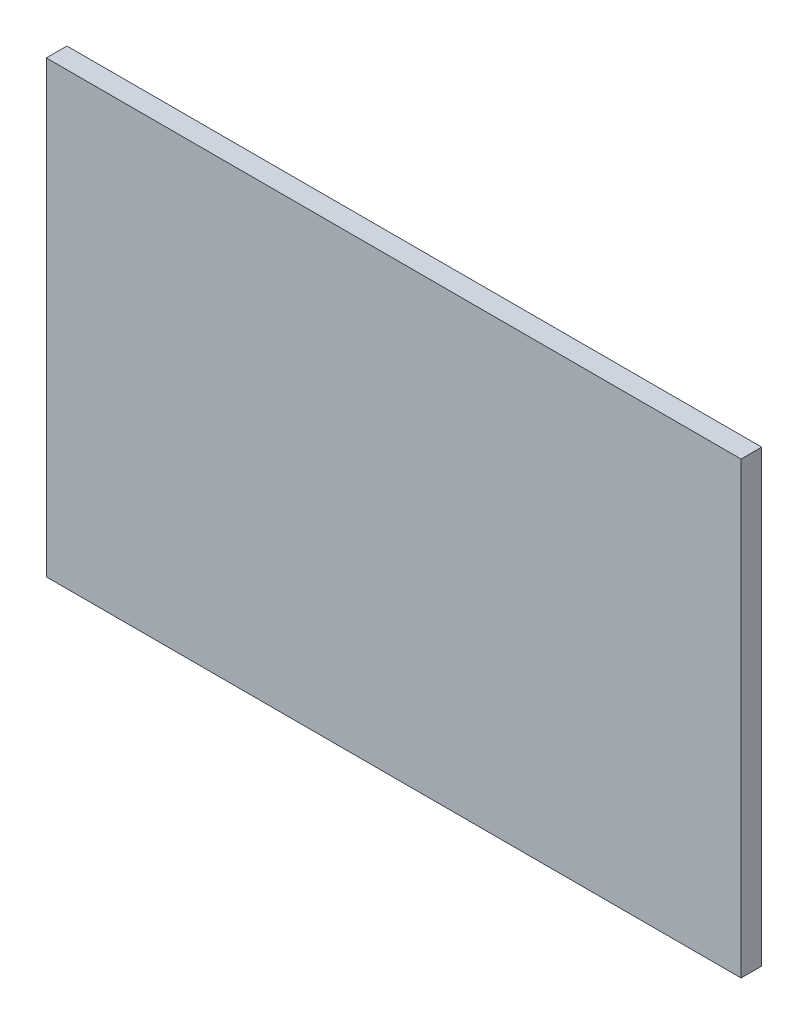
ISO-10303-21;
HEADER;
FILE_DESCRIPTION(('STEP AP214'),'2;1');
FILE_NAME('part.step','',(''),(''),'','','');
FILE_SCHEMA(('AUTOMOTIVE_DESIGN { 1 0 10303 214 1 1 1 1 }'));
ENDSEC;
DATA;
#1=APPLICATION_CONTEXT('core data for automotive mechanical design processes');
#2=APPLICATION_PROTOCOL_DEFINITION('international standard','automotive_design',2000,#1);
#3=PRODUCT_CONTEXT('',#1,'mechanical');
#4=PRODUCT('Part','Part','',(#3));
#5=PRODUCT_RELATED_PRODUCT_CATEGORY('part','',(#4));
#6=PRODUCT_DEFINITION_FORMATION('','',#4);
#7=PRODUCT_DEFINITION_CONTEXT('part definition',#1,'design');
#8=PRODUCT_DEFINITION('design','',#6,#7);
#9=PRODUCT_DEFINITION_SHAPE('','',#8);
#10=(LENGTH_UNIT() NAMED_UNIT(*) SI_UNIT(.MILLI.,.METRE.));
#11=(NAMED_UNIT(*) PLANE_ANGLE_UNIT() SI_UNIT($,.RADIAN.));
#12=(NAMED_UNIT(*) SI_UNIT($,.STERADIAN.) SOLID_ANGLE_UNIT());
#13=UNCERTAINTY_MEASURE_WITH_UNIT(LENGTH_MEASURE(1.E-05),#10,'distance_accuracy_value','');
#14=(GEOMETRIC_REPRESENTATION_CONTEXT(3) GLOBAL_UNCERTAINTY_ASSIGNED_CONTEXT((#13)) GLOBAL_UNIT_ASSIGNED_CONTEXT((#10,
#11,#12)) REPRESENTATION_CONTEXT('',''));
#15=CARTESIAN_POINT('',(0.,0.,0.));
#16=DIRECTION('',(0.,0.,1.));
#17=DIRECTION('',(1.,0.,0.));
#18=AXIS2_PLACEMENT_3D('',#15,#16,#17);
#19=CARTESIAN_POINT('',(84.25,-38.7195,5.));
#20=DIRECTION('',(0.,-1.,0.));
#21=DIRECTION('',(0.,0.,-1.));
#22=AXIS2_PLACEMENT_3D('',#19,#20,#21);
#23=PLANE('',#22);
#24=DIRECTION('',(-1.,0.,0.));
#25=VECTOR('',#24,1.);
#26=CARTESIAN_POINT('',(84.25,-38.7195,0.));
#27=LINE('',#26,#25);
#28=CARTESIAN_POINT('',(84.25,-38.7195,0.));
#29=VERTEX_POINT('',#28);
#30=CARTESIAN_POINT('',(-84.25,-38.7195,0.));
#31=VERTEX_POINT('',#30);
#32=EDGE_CURVE('E116',#29,#31,#27,.T.);
#33=ORIENTED_EDGE('',*,*,#32,.F.);
#34=DIRECTION('',(0.,0.,-1.));
#35=VECTOR('',#34,1.);
#36=CARTESIAN_POINT('',(84.25,-38.7195,5.));
#37=LINE('',#36,#35);
#38=CARTESIAN_POINT('',(84.25,-38.7195,5.));
#39=VERTEX_POINT('',#38);
#40=EDGE_CURVE('E11',#39,#29,#37,.T.);
#41=ORIENTED_EDGE('',*,*,#40,.F.);
#42=DIRECTION('',(-1.,0.,0.));
#43=VECTOR('',#42,1.);
#44=CARTESIAN_POINT('',(84.25,-38.7195,5.));
#45=LINE('',#44,#43);
#46=CARTESIAN_POINT('',(-84.25,-38.7195,5.));
#47=VERTEX_POINT('',#46);
#48=EDGE_CURVE('E109',#39,#47,#45,.T.);
#49=ORIENTED_EDGE('',*,*,#48,.T.);
#50=DIRECTION('',(0.,0.,-1.));
#51=VECTOR('',#50,1.);
#52=CARTESIAN_POINT('',(-84.25,-38.7195,5.));
#53=LINE('',#52,#51);
#54=EDGE_CURVE('E48',#47,#31,#53,.T.);
#55=ORIENTED_EDGE('',*,*,#54,.T.);
#56=EDGE_LOOP('',(#33,#41,#49,#55));
#57=FACE_BOUND('',#56,.T.);
#58=ADVANCED_FACE('F45',(#57),#23,.T.);
#59=CARTESIAN_POINT('',(84.25,-38.7195,5.));
#60=DIRECTION('',(-1.,0.,0.));
#61=DIRECTION('',(0.,-1.,0.));
#62=AXIS2_PLACEMENT_3D('',#59,#60,#61);
#63=PLANE('',#62);
#64=DIRECTION('',(0.,1.,0.));
#65=VECTOR('',#64,1.);
#66=CARTESIAN_POINT('',(84.25,-38.7195,0.));
#67=LINE('',#66,#65);
#68=CARTESIAN_POINT('',(84.25,70.2805,0.));
#69=VERTEX_POINT('',#68);
#70=EDGE_CURVE('E79',#29,#69,#67,.T.);
#71=ORIENTED_EDGE('',*,*,#70,.T.);
#72=DIRECTION('',(0.,0.,-1.));
#73=VECTOR('',#72,1.);
#74=CARTESIAN_POINT('',(84.25,70.2805,5.));
#75=LINE('',#74,#73);
#76=CARTESIAN_POINT('',(84.25,70.2805,5.));
#77=VERTEX_POINT('',#76);
#78=EDGE_CURVE('E55',#77,#69,#75,.T.);
#79=ORIENTED_EDGE('',*,*,#78,.F.);
#80=DIRECTION('',(0.,1.,0.));
#81=VECTOR('',#80,1.);
#82=CARTESIAN_POINT('',(84.25,-38.7195,5.));
#83=LINE('',#82,#81);
#84=EDGE_CURVE('E96',#39,#77,#83,.T.);
#85=ORIENTED_EDGE('',*,*,#84,.F.);
#86=ORIENTED_EDGE('',*,*,#40,.T.);
#87=EDGE_LOOP('',(#71,#79,#85,#86));
#88=FACE_BOUND('',#87,.T.);
#89=ADVANCED_FACE('F132',(#88),#63,.F.);
#90=CARTESIAN_POINT('',(84.25,70.2805,5.));
#91=DIRECTION('',(0.,-1.,0.));
#92=DIRECTION('',(0.,0.,-1.));
#93=AXIS2_PLACEMENT_3D('',#90,#91,#92);
#94=PLANE('',#93);
#95=DIRECTION('',(-1.,0.,0.));
#96=VECTOR('',#95,1.);
#97=CARTESIAN_POINT('',(84.25,70.2805,0.));
#98=LINE('',#97,#96);
#99=CARTESIAN_POINT('',(-84.25,70.2805,0.));
#100=VERTEX_POINT('',#99);
#101=EDGE_CURVE('E104',#69,#100,#98,.T.);
#102=ORIENTED_EDGE('',*,*,#101,.T.);
#103=DIRECTION('',(0.,0.,-1.));
#104=VECTOR('',#103,1.);
#105=CARTESIAN_POINT('',(-84.25,70.2805,5.));
#106=LINE('',#105,#104);
#107=CARTESIAN_POINT('',(-84.25,70.2805,5.));
#108=VERTEX_POINT('',#107);
#109=EDGE_CURVE('E101',#108,#100,#106,.T.);
#110=ORIENTED_EDGE('',*,*,#109,.F.);
#111=DIRECTION('',(-1.,0.,0.));
#112=VECTOR('',#111,1.);
#113=CARTESIAN_POINT('',(84.25,70.2805,5.));
#114=LINE('',#113,#112);
#115=EDGE_CURVE('E91',#77,#108,#114,.T.);
#116=ORIENTED_EDGE('',*,*,#115,.F.);
#117=ORIENTED_EDGE('',*,*,#78,.T.);
#118=EDGE_LOOP('',(#102,#110,#116,#117));
#119=FACE_BOUND('',#118,.T.);
#120=ADVANCED_FACE('F102',(#119),#94,.F.);
#121=CARTESIAN_POINT('',(-84.25,-38.7195,5.));
#122=DIRECTION('',(-1.,0.,0.));
#123=DIRECTION('',(0.,0.,1.));
#124=AXIS2_PLACEMENT_3D('',#121,#122,#123);
#125=PLANE('',#124);
#126=DIRECTION('',(0.,1.,0.));
#127=VECTOR('',#126,1.);
#128=CARTESIAN_POINT('',(-84.25,-38.7195,0.));
#129=LINE('',#128,#127);
#130=EDGE_CURVE('E120',#31,#100,#129,.T.);
#131=ORIENTED_EDGE('',*,*,#130,.F.);
#132=ORIENTED_EDGE('',*,*,#54,.F.);
#133=DIRECTION('',(0.,1.,0.));
#134=VECTOR('',#133,1.);
#135=CARTESIAN_POINT('',(-84.25,-38.7195,5.));
#136=LINE('',#135,#134);
#137=EDGE_CURVE('E95',#47,#108,#136,.T.);
#138=ORIENTED_EDGE('',*,*,#137,.T.);
#139=ORIENTED_EDGE('',*,*,#109,.T.);
#140=EDGE_LOOP('',(#131,#132,#138,#139));
#141=FACE_BOUND('',#140,.T.);
#142=ADVANCED_FACE('F107',(#141),#125,.T.);
#143=CARTESIAN_POINT('',(0.,0.,5.));
#144=DIRECTION('',(0.,0.,-1.));
#145=DIRECTION('',(-1.,0.,0.));
#146=AXIS2_PLACEMENT_3D('',#143,#144,#145);
#147=PLANE('',#146);
#148=ORIENTED_EDGE('',*,*,#48,.F.);
#149=ORIENTED_EDGE('',*,*,#84,.T.);
#150=ORIENTED_EDGE('',*,*,#115,.T.);
#151=ORIENTED_EDGE('',*,*,#137,.F.);
#152=EDGE_LOOP('',(#148,#149,#150,#151));
#153=FACE_BOUND('',#152,.T.);
#154=ADVANCED_FACE('F94',(#153),#147,.F.);
#155=CARTESIAN_POINT('',(0.,0.,0.));
#156=DIRECTION('',(0.,0.,-1.));
#157=DIRECTION('',(-1.,0.,0.));
#158=AXIS2_PLACEMENT_3D('',#155,#156,#157);
#159=PLANE('',#158);
#160=ORIENTED_EDGE('',*,*,#32,.T.);
#161=ORIENTED_EDGE('',*,*,#130,.T.);
#162=ORIENTED_EDGE('',*,*,#101,.F.);
#163=ORIENTED_EDGE('',*,*,#70,.F.);
#164=EDGE_LOOP('',(#160,#161,#162,#163));
#165=FACE_BOUND('',#164,.T.);
#166=ADVANCED_FACE('F129',(#165),#159,.T.);
#167=CLOSED_SHELL('',(#58,#89,#120,#142,#154,#166));
#168=MANIFOLD_SOLID_BREP('B2',#167);
#169=ADVANCED_BREP_SHAPE_REPRESENTATION('',(#18,#168),#14);
#170=SHAPE_DEFINITION_REPRESENTATION(#9,#169);
ENDSEC;
END-ISO-10303-21;
